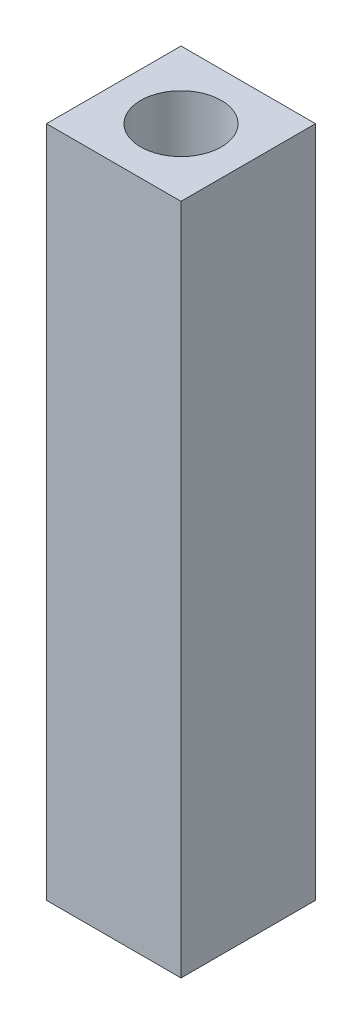
ISO-10303-21;
HEADER;
FILE_DESCRIPTION(('STEP AP214'),'2;1');
FILE_NAME('part.step','',(''),(''),'','','');
FILE_SCHEMA(('AUTOMOTIVE_DESIGN { 1 0 10303 214 1 1 1 1 }'));
ENDSEC;
DATA;
#1=APPLICATION_CONTEXT('core data for automotive mechanical design processes');
#2=APPLICATION_PROTOCOL_DEFINITION('international standard','automotive_design',2000,#1);
#3=PRODUCT_CONTEXT('',#1,'mechanical');
#4=PRODUCT('Part','Part','',(#3));
#5=PRODUCT_RELATED_PRODUCT_CATEGORY('part','',(#4));
#6=PRODUCT_DEFINITION_FORMATION('','',#4);
#7=PRODUCT_DEFINITION_CONTEXT('part definition',#1,'design');
#8=PRODUCT_DEFINITION('design','',#6,#7);
#9=PRODUCT_DEFINITION_SHAPE('','',#8);
#10=(LENGTH_UNIT() NAMED_UNIT(*) SI_UNIT(.MILLI.,.METRE.));
#11=(NAMED_UNIT(*) PLANE_ANGLE_UNIT() SI_UNIT($,.RADIAN.));
#12=(NAMED_UNIT(*) SI_UNIT($,.STERADIAN.) SOLID_ANGLE_UNIT());
#13=UNCERTAINTY_MEASURE_WITH_UNIT(LENGTH_MEASURE(1.E-05),#10,'distance_accuracy_value','');
#14=(GEOMETRIC_REPRESENTATION_CONTEXT(3) GLOBAL_UNCERTAINTY_ASSIGNED_CONTEXT((#13)) GLOBAL_UNIT_ASSIGNED_CONTEXT((#10,
#11,#12)) REPRESENTATION_CONTEXT('',''));
#15=CARTESIAN_POINT('',(0.,0.,0.));
#16=DIRECTION('',(0.,0.,1.));
#17=DIRECTION('',(1.,0.,0.));
#18=AXIS2_PLACEMENT_3D('',#15,#16,#17);
#19=CARTESIAN_POINT('',(5.,50.,-5.));
#20=DIRECTION('',(-1.,0.,0.));
#21=DIRECTION('',(0.,0.,1.));
#22=AXIS2_PLACEMENT_3D('',#19,#20,#21);
#23=PLANE('',#22);
#24=DIRECTION('',(0.,0.,-1.));
#25=VECTOR('',#24,1.);
#26=CARTESIAN_POINT('',(5.,0.,-5.));
#27=LINE('',#26,#25);
#28=CARTESIAN_POINT('',(5.,0.,5.));
#29=VERTEX_POINT('',#28);
#30=CARTESIAN_POINT('',(5.,0.,-5.));
#31=VERTEX_POINT('',#30);
#32=EDGE_CURVE('E107',#29,#31,#27,.T.);
#33=ORIENTED_EDGE('',*,*,#32,.T.);
#34=DIRECTION('',(0.,-1.,0.));
#35=VECTOR('',#34,1.);
#36=CARTESIAN_POINT('',(5.,50.,-5.));
#37=LINE('',#36,#35);
#38=CARTESIAN_POINT('',(5.,50.,-5.));
#39=VERTEX_POINT('',#38);
#40=EDGE_CURVE('E11',#39,#31,#37,.T.);
#41=ORIENTED_EDGE('',*,*,#40,.F.);
#42=DIRECTION('',(0.,0.,-1.));
#43=VECTOR('',#42,1.);
#44=CARTESIAN_POINT('',(5.,50.,-5.));
#45=LINE('',#44,#43);
#46=CARTESIAN_POINT('',(5.,50.,5.));
#47=VERTEX_POINT('',#46);
#48=EDGE_CURVE('E91',#47,#39,#45,.T.);
#49=ORIENTED_EDGE('',*,*,#48,.F.);
#50=DIRECTION('',(0.,-1.,0.));
#51=VECTOR('',#50,1.);
#52=CARTESIAN_POINT('',(5.,50.,5.));
#53=LINE('',#52,#51);
#54=EDGE_CURVE('E103',#47,#29,#53,.T.);
#55=ORIENTED_EDGE('',*,*,#54,.T.);
#56=EDGE_LOOP('',(#33,#41,#49,#55));
#57=FACE_BOUND('',#56,.T.);
#58=ADVANCED_FACE('F39',(#57),#23,.F.);
#59=CARTESIAN_POINT('',(-5.,50.,-5.));
#60=DIRECTION('',(0.,0.,1.));
#61=DIRECTION('',(1.,0.,0.));
#62=AXIS2_PLACEMENT_3D('',#59,#60,#61);
#63=PLANE('',#62);
#64=DIRECTION('',(-1.,0.,0.));
#65=VECTOR('',#64,1.);
#66=CARTESIAN_POINT('',(-5.,0.,-5.));
#67=LINE('',#66,#65);
#68=CARTESIAN_POINT('',(-5.,0.,-5.));
#69=VERTEX_POINT('',#68);
#70=EDGE_CURVE('E96',#31,#69,#67,.T.);
#71=ORIENTED_EDGE('',*,*,#70,.T.);
#72=DIRECTION('',(0.,-1.,0.));
#73=VECTOR('',#72,1.);
#74=CARTESIAN_POINT('',(-5.,50.,-5.));
#75=LINE('',#74,#73);
#76=CARTESIAN_POINT('',(-5.,50.,-5.));
#77=VERTEX_POINT('',#76);
#78=EDGE_CURVE('E48',#77,#69,#75,.T.);
#79=ORIENTED_EDGE('',*,*,#78,.F.);
#80=DIRECTION('',(-1.,0.,0.));
#81=VECTOR('',#80,1.);
#82=CARTESIAN_POINT('',(-5.,50.,-5.));
#83=LINE('',#82,#81);
#84=EDGE_CURVE('E86',#39,#77,#83,.T.);
#85=ORIENTED_EDGE('',*,*,#84,.F.);
#86=ORIENTED_EDGE('',*,*,#40,.T.);
#87=EDGE_LOOP('',(#71,#79,#85,#86));
#88=FACE_BOUND('',#87,.T.);
#89=ADVANCED_FACE('F95',(#88),#63,.F.);
#90=CARTESIAN_POINT('',(-5.,50.,-5.));
#91=DIRECTION('',(1.,0.,0.));
#92=DIRECTION('',(0.,0.,-1.));
#93=AXIS2_PLACEMENT_3D('',#90,#91,#92);
#94=PLANE('',#93);
#95=DIRECTION('',(0.,0.,1.));
#96=VECTOR('',#95,1.);
#97=CARTESIAN_POINT('',(-5.,0.,-5.));
#98=LINE('',#97,#96);
#99=CARTESIAN_POINT('',(-5.,0.,5.));
#100=VERTEX_POINT('',#99);
#101=EDGE_CURVE('E73',#69,#100,#98,.T.);
#102=ORIENTED_EDGE('',*,*,#101,.T.);
#103=DIRECTION('',(0.,-1.,0.));
#104=VECTOR('',#103,1.);
#105=CARTESIAN_POINT('',(-5.,50.,5.));
#106=LINE('',#105,#104);
#107=CARTESIAN_POINT('',(-5.,50.,5.));
#108=VERTEX_POINT('',#107);
#109=EDGE_CURVE('E98',#108,#100,#106,.T.);
#110=ORIENTED_EDGE('',*,*,#109,.F.);
#111=DIRECTION('',(0.,0.,1.));
#112=VECTOR('',#111,1.);
#113=CARTESIAN_POINT('',(-5.,50.,-5.));
#114=LINE('',#113,#112);
#115=EDGE_CURVE('E89',#77,#108,#114,.T.);
#116=ORIENTED_EDGE('',*,*,#115,.F.);
#117=ORIENTED_EDGE('',*,*,#78,.T.);
#118=EDGE_LOOP('',(#102,#110,#116,#117));
#119=FACE_BOUND('',#118,.T.);
#120=ADVANCED_FACE('F99',(#119),#94,.F.);
#121=CARTESIAN_POINT('',(-5.,50.,5.));
#122=DIRECTION('',(0.,0.,-1.));
#123=DIRECTION('',(-1.,0.,0.));
#124=AXIS2_PLACEMENT_3D('',#121,#122,#123);
#125=PLANE('',#124);
#126=DIRECTION('',(1.,0.,0.));
#127=VECTOR('',#126,1.);
#128=CARTESIAN_POINT('',(-5.,0.,5.));
#129=LINE('',#128,#127);
#130=EDGE_CURVE('E79',#100,#29,#129,.T.);
#131=ORIENTED_EDGE('',*,*,#130,.T.);
#132=ORIENTED_EDGE('',*,*,#54,.F.);
#133=DIRECTION('',(1.,0.,0.));
#134=VECTOR('',#133,1.);
#135=CARTESIAN_POINT('',(-5.,50.,5.));
#136=LINE('',#135,#134);
#137=EDGE_CURVE('E56',#108,#47,#136,.T.);
#138=ORIENTED_EDGE('',*,*,#137,.F.);
#139=ORIENTED_EDGE('',*,*,#109,.T.);
#140=EDGE_LOOP('',(#131,#132,#138,#139));
#141=FACE_BOUND('',#140,.T.);
#142=ADVANCED_FACE('F121',(#141),#125,.F.);
#143=CARTESIAN_POINT('',(0.,50.,0.));
#144=DIRECTION('',(0.,1.,0.));
#145=DIRECTION('',(0.,0.,1.));
#146=AXIS2_PLACEMENT_3D('',#143,#144,#145);
#147=PLANE('',#146);
#148=CARTESIAN_POINT('',(0.,50.,0.));
#149=DIRECTION('',(0.,-1.,0.));
#150=DIRECTION('',(0.,0.,-1.));
#151=AXIS2_PLACEMENT_3D('',#148,#149,#150);
#152=CIRCLE('',#151,3.);
#153=CARTESIAN_POINT('',(0.,50.,-3.));
#154=VERTEX_POINT('',#153);
#155=EDGE_CURVE('E132',#154,#154,#152,.T.);
#156=ORIENTED_EDGE('',*,*,#155,.T.);
#157=EDGE_LOOP('',(#156));
#158=FACE_BOUND('',#157,.T.);
#159=ORIENTED_EDGE('',*,*,#48,.T.);
#160=ORIENTED_EDGE('',*,*,#84,.T.);
#161=ORIENTED_EDGE('',*,*,#115,.T.);
#162=ORIENTED_EDGE('',*,*,#137,.T.);
#163=EDGE_LOOP('',(#159,#160,#161,#162));
#164=FACE_BOUND('',#163,.T.);
#165=ADVANCED_FACE('F87',(#158,#164),#147,.T.);
#166=CARTESIAN_POINT('',(0.,0.,0.));
#167=DIRECTION('',(0.,1.,0.));
#168=DIRECTION('',(0.,0.,1.));
#169=AXIS2_PLACEMENT_3D('',#166,#167,#168);
#170=PLANE('',#169);
#171=CARTESIAN_POINT('',(0.,0.,0.));
#172=DIRECTION('',(0.,-1.,0.));
#173=DIRECTION('',(0.,0.,-1.));
#174=AXIS2_PLACEMENT_3D('',#171,#172,#173);
#175=CIRCLE('',#174,3.);
#176=CARTESIAN_POINT('',(0.,0.,-3.));
#177=VERTEX_POINT('',#176);
#178=EDGE_CURVE('E128',#177,#177,#175,.T.);
#179=ORIENTED_EDGE('',*,*,#178,.F.);
#180=EDGE_LOOP('',(#179));
#181=FACE_BOUND('',#180,.T.);
#182=ORIENTED_EDGE('',*,*,#32,.F.);
#183=ORIENTED_EDGE('',*,*,#130,.F.);
#184=ORIENTED_EDGE('',*,*,#101,.F.);
#185=ORIENTED_EDGE('',*,*,#70,.F.);
#186=EDGE_LOOP('',(#182,#183,#184,#185));
#187=FACE_BOUND('',#186,.T.);
#188=ADVANCED_FACE('F124',(#181,#187),#170,.F.);
#189=CARTESIAN_POINT('',(0.,20.,0.));
#190=DIRECTION('',(0.,-1.,0.));
#191=DIRECTION('',(0.,0.,-1.));
#192=AXIS2_PLACEMENT_3D('',#189,#190,#191);
#193=CYLINDRICAL_SURFACE('',#192,3.);
#194=CARTESIAN_POINT('',(0.,20.,0.));
#195=DIRECTION('',(0.,-1.,0.));
#196=DIRECTION('',(0.,0.,-1.));
#197=AXIS2_PLACEMENT_3D('',#194,#195,#196);
#198=CIRCLE('',#197,3.);
#199=CARTESIAN_POINT('',(0.,20.,-3.));
#200=VERTEX_POINT('',#199);
#201=EDGE_CURVE('E111',#200,#200,#198,.T.);
#202=ORIENTED_EDGE('',*,*,#201,.F.);
#203=EDGE_LOOP('',(#202));
#204=FACE_BOUND('',#203,.T.);
#205=ORIENTED_EDGE('',*,*,#178,.T.);
#206=EDGE_LOOP('',(#205));
#207=FACE_BOUND('',#206,.T.);
#208=ADVANCED_FACE('F170',(#204,#207),#193,.F.);
#209=CARTESIAN_POINT('',(0.,20.,0.));
#210=DIRECTION('',(0.,-1.,0.));
#211=DIRECTION('',(0.,0.,-1.));
#212=AXIS2_PLACEMENT_3D('',#209,#210,#211);
#213=PLANE('',#212);
#214=ORIENTED_EDGE('',*,*,#201,.T.);
#215=EDGE_LOOP('',(#214));
#216=FACE_BOUND('',#215,.T.);
#217=ADVANCED_FACE('F149',(#216),#213,.T.);
#218=CARTESIAN_POINT('',(0.,50.,0.));
#219=DIRECTION('',(0.,-1.,0.));
#220=DIRECTION('',(0.,0.,-1.));
#221=AXIS2_PLACEMENT_3D('',#218,#219,#220);
#222=CYLINDRICAL_SURFACE('',#221,3.);
#223=ORIENTED_EDGE('',*,*,#155,.F.);
#224=EDGE_LOOP('',(#223));
#225=FACE_BOUND('',#224,.T.);
#226=CARTESIAN_POINT('',(0.,30.,0.));
#227=DIRECTION('',(0.,-1.,0.));
#228=DIRECTION('',(0.,0.,-1.));
#229=AXIS2_PLACEMENT_3D('',#226,#227,#228);
#230=CIRCLE('',#229,3.);
#231=CARTESIAN_POINT('',(0.,30.,-3.));
#232=VERTEX_POINT('',#231);
#233=EDGE_CURVE('E136',#232,#232,#230,.T.);
#234=ORIENTED_EDGE('',*,*,#233,.T.);
#235=EDGE_LOOP('',(#234));
#236=FACE_BOUND('',#235,.T.);
#237=ADVANCED_FACE('F145',(#225,#236),#222,.F.);
#238=CARTESIAN_POINT('',(0.,30.,0.));
#239=DIRECTION('',(0.,-1.,0.));
#240=DIRECTION('',(0.,0.,-1.));
#241=AXIS2_PLACEMENT_3D('',#238,#239,#240);
#242=PLANE('',#241);
#243=ORIENTED_EDGE('',*,*,#233,.F.);
#244=EDGE_LOOP('',(#243));
#245=FACE_BOUND('',#244,.T.);
#246=ADVANCED_FACE('F148',(#245),#242,.F.);
#247=CLOSED_SHELL('',(#58,#89,#120,#142,#165,#188,#208,#217,#237,#246));
#248=MANIFOLD_SOLID_BREP('B2',#247);
#249=ADVANCED_BREP_SHAPE_REPRESENTATION('',(#18,#248),#14);
#250=SHAPE_DEFINITION_REPRESENTATION(#9,#249);
ENDSEC;
END-ISO-10303-21;
